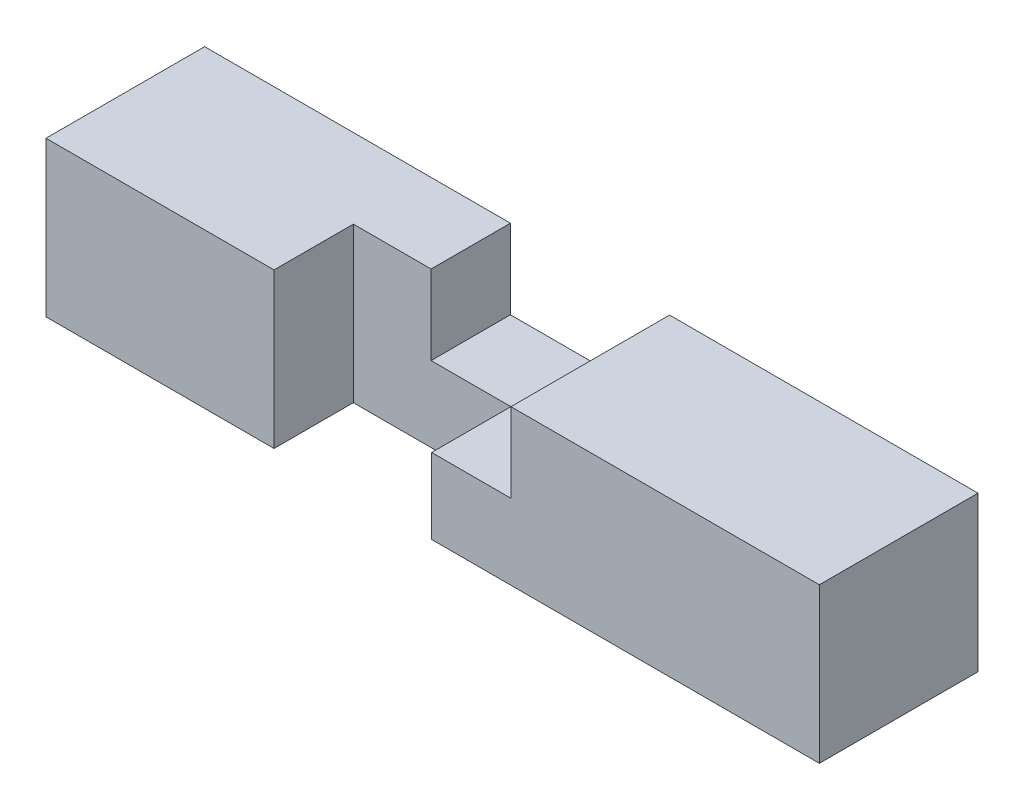
ISO-10303-21;
HEADER;
FILE_DESCRIPTION(('STEP AP214'),'2;1');
FILE_NAME('part.step','',(''),(''),'','','');
FILE_SCHEMA(('AUTOMOTIVE_DESIGN { 1 0 10303 214 1 1 1 1 }'));
ENDSEC;
DATA;
#1=APPLICATION_CONTEXT('core data for automotive mechanical design processes');
#2=APPLICATION_PROTOCOL_DEFINITION('international standard','automotive_design',2000,#1);
#3=PRODUCT_CONTEXT('',#1,'mechanical');
#4=PRODUCT('Part','Part','',(#3));
#5=PRODUCT_RELATED_PRODUCT_CATEGORY('part','',(#4));
#6=PRODUCT_DEFINITION_FORMATION('','',#4);
#7=PRODUCT_DEFINITION_CONTEXT('part definition',#1,'design');
#8=PRODUCT_DEFINITION('design','',#6,#7);
#9=PRODUCT_DEFINITION_SHAPE('','',#8);
#10=(LENGTH_UNIT() NAMED_UNIT(*) SI_UNIT(.MILLI.,.METRE.));
#11=(NAMED_UNIT(*) PLANE_ANGLE_UNIT() SI_UNIT($,.RADIAN.));
#12=(NAMED_UNIT(*) SI_UNIT($,.STERADIAN.) SOLID_ANGLE_UNIT());
#13=UNCERTAINTY_MEASURE_WITH_UNIT(LENGTH_MEASURE(1.E-05),#10,'distance_accuracy_value','');
#14=(GEOMETRIC_REPRESENTATION_CONTEXT(3) GLOBAL_UNCERTAINTY_ASSIGNED_CONTEXT((#13)) GLOBAL_UNIT_ASSIGNED_CONTEXT((#10,
#11,#12)) REPRESENTATION_CONTEXT('',''));
#15=CARTESIAN_POINT('',(0.,0.,0.));
#16=DIRECTION('',(0.,0.,1.));
#17=DIRECTION('',(1.,0.,0.));
#18=AXIS2_PLACEMENT_3D('',#15,#16,#17);
#19=CARTESIAN_POINT('',(0.,0.,20.));
#20=DIRECTION('',(0.,0.,1.));
#21=DIRECTION('',(1.,0.,0.));
#22=AXIS2_PLACEMENT_3D('',#19,#20,#21);
#23=PLANE('',#22);
#24=DIRECTION('',(0.,-1.,0.));
#25=VECTOR('',#24,1.);
#26=CARTESIAN_POINT('',(-20.,0.,20.));
#27=LINE('',#26,#25);
#28=CARTESIAN_POINT('',(-20.,9.75000000000001,20.));
#29=VERTEX_POINT('',#28);
#30=CARTESIAN_POINT('',(-20.,-9.75,20.));
#31=VERTEX_POINT('',#30);
#32=EDGE_CURVE('E480',#29,#31,#27,.T.);
#33=ORIENTED_EDGE('',*,*,#32,.F.);
#34=DIRECTION('',(-1.,0.,0.));
#35=VECTOR('',#34,1.);
#36=CARTESIAN_POINT('',(-48.7499999999999,9.75,20.));
#37=LINE('',#36,#35);
#38=CARTESIAN_POINT('',(-48.7499999999999,9.75,20.));
#39=VERTEX_POINT('',#38);
#40=EDGE_CURVE('E450',#29,#39,#37,.T.);
#41=ORIENTED_EDGE('',*,*,#40,.T.);
#42=DIRECTION('',(0.,-1.,0.));
#43=VECTOR('',#42,1.);
#44=CARTESIAN_POINT('',(-48.7499999999999,9.75,20.));
#45=LINE('',#44,#43);
#46=CARTESIAN_POINT('',(-48.7499999999999,-9.75,20.));
#47=VERTEX_POINT('',#46);
#48=EDGE_CURVE('E454',#39,#47,#45,.T.);
#49=ORIENTED_EDGE('',*,*,#48,.T.);
#50=DIRECTION('',(1.,0.,0.));
#51=VECTOR('',#50,1.);
#52=CARTESIAN_POINT('',(-48.7499999999999,-9.75,20.));
#53=LINE('',#52,#51);
#54=EDGE_CURVE('E457',#47,#31,#53,.T.);
#55=ORIENTED_EDGE('',*,*,#54,.T.);
#56=EDGE_LOOP('',(#33,#41,#49,#55));
#57=FACE_BOUND('',#56,.T.);
#58=ADVANCED_FACE('F36',(#57),#23,.T.);
#59=CARTESIAN_POINT('',(-20.,-19.25,10.));
#60=DIRECTION('',(-1.,0.,0.));
#61=DIRECTION('',(0.,0.,1.));
#62=AXIS2_PLACEMENT_3D('',#59,#60,#61);
#63=PLANE('',#62);
#64=DIRECTION('',(0.,1.,0.));
#65=VECTOR('',#64,1.);
#66=CARTESIAN_POINT('',(-20.,-19.25,10.));
#67=LINE('',#66,#65);
#68=CARTESIAN_POINT('',(-20.,-9.75,10.));
#69=VERTEX_POINT('',#68);
#70=CARTESIAN_POINT('',(-20.,9.75000000000001,10.));
#71=VERTEX_POINT('',#70);
#72=EDGE_CURVE('E441',#69,#71,#67,.T.);
#73=ORIENTED_EDGE('',*,*,#72,.T.);
#74=DIRECTION('',(0.,0.,1.));
#75=VECTOR('',#74,1.);
#76=CARTESIAN_POINT('',(-20.,9.75000000000001,10.));
#77=LINE('',#76,#75);
#78=EDGE_CURVE('E439',#71,#29,#77,.T.);
#79=ORIENTED_EDGE('',*,*,#78,.T.);
#80=ORIENTED_EDGE('',*,*,#32,.T.);
#81=DIRECTION('',(0.,0.,1.));
#82=VECTOR('',#81,1.);
#83=CARTESIAN_POINT('',(-20.,-9.74999999999999,20.));
#84=LINE('',#83,#82);
#85=EDGE_CURVE('E443',#69,#31,#84,.T.);
#86=ORIENTED_EDGE('',*,*,#85,.F.);
#87=EDGE_LOOP('',(#73,#79,#80,#86));
#88=FACE_BOUND('',#87,.T.);
#89=ADVANCED_FACE('F565',(#88),#63,.F.);
#90=CARTESIAN_POINT('',(-20.,-19.25,10.));
#91=DIRECTION('',(0.,0.,-1.));
#92=DIRECTION('',(-1.,0.,0.));
#93=AXIS2_PLACEMENT_3D('',#90,#91,#92);
#94=PLANE('',#93);
#95=DIRECTION('',(1.,0.,0.));
#96=VECTOR('',#95,1.);
#97=CARTESIAN_POINT('',(0.,-0.24999999999999,10.));
#98=LINE('',#97,#96);
#99=CARTESIAN_POINT('',(-10.2,-0.24999999999999,9.99999999999999));
#100=VERTEX_POINT('',#99);
#101=CARTESIAN_POINT('',(-0.134722900240405,-0.24999999999999,10.));
#102=VERTEX_POINT('',#101);
#103=EDGE_CURVE('E390',#100,#102,#98,.T.);
#104=ORIENTED_EDGE('',*,*,#103,.F.);
#105=DIRECTION('',(0.,-1.,0.));
#106=VECTOR('',#105,1.);
#107=CARTESIAN_POINT('',(-10.2,9.75000000000001,10.));
#108=LINE('',#107,#106);
#109=CARTESIAN_POINT('',(-10.2,9.75000000000001,10.));
#110=VERTEX_POINT('',#109);
#111=EDGE_CURVE('E280',#110,#100,#108,.T.);
#112=ORIENTED_EDGE('',*,*,#111,.F.);
#113=DIRECTION('',(1.,0.,0.));
#114=VECTOR('',#113,1.);
#115=CARTESIAN_POINT('',(-20.,9.75000000000001,10.));
#116=LINE('',#115,#114);
#117=EDGE_CURVE('E270',#71,#110,#116,.T.);
#118=ORIENTED_EDGE('',*,*,#117,.F.);
#119=ORIENTED_EDGE('',*,*,#72,.F.);
#120=DIRECTION('',(-1.,0.,0.));
#121=VECTOR('',#120,1.);
#122=CARTESIAN_POINT('',(-48.7499999999999,-9.75,10.));
#123=LINE('',#122,#121);
#124=CARTESIAN_POINT('',(-0.134722900240405,-9.75,10.));
#125=VERTEX_POINT('',#124);
#126=EDGE_CURVE('E482',#125,#69,#123,.T.);
#127=ORIENTED_EDGE('',*,*,#126,.F.);
#128=DIRECTION('',(0.,1.,0.));
#129=VECTOR('',#128,1.);
#130=CARTESIAN_POINT('',(-0.134722900240405,-10.25,10.));
#131=LINE('',#130,#129);
#132=EDGE_CURVE('E349',#125,#102,#131,.T.);
#133=ORIENTED_EDGE('',*,*,#132,.T.);
#134=EDGE_LOOP('',(#104,#112,#118,#119,#127,#133));
#135=FACE_BOUND('',#134,.T.);
#136=ADVANCED_FACE('F568',(#135),#94,.F.);
#137=CARTESIAN_POINT('',(-0.134722900240405,-10.25,10.));
#138=DIRECTION('',(-1.,0.,0.));
#139=DIRECTION('',(0.,0.,1.));
#140=AXIS2_PLACEMENT_3D('',#137,#138,#139);
#141=PLANE('',#140);
#142=DIRECTION('',(0.,0.,-1.));
#143=VECTOR('',#142,1.);
#144=CARTESIAN_POINT('',(-0.134722900240405,-9.75,10.));
#145=LINE('',#144,#143);
#146=CARTESIAN_POINT('',(-0.134722900240404,-9.75,20.));
#147=VERTEX_POINT('',#146);
#148=EDGE_CURVE('E11',#147,#125,#145,.T.);
#149=ORIENTED_EDGE('',*,*,#148,.F.);
#150=DIRECTION('',(0.,1.,0.));
#151=VECTOR('',#150,1.);
#152=CARTESIAN_POINT('',(-0.134722900240404,-10.25,20.));
#153=LINE('',#152,#151);
#154=CARTESIAN_POINT('',(-0.134722900240404,-0.24999999999999,20.));
#155=VERTEX_POINT('',#154);
#156=EDGE_CURVE('E350',#147,#155,#153,.T.);
#157=ORIENTED_EDGE('',*,*,#156,.T.);
#158=DIRECTION('',(0.,0.,1.));
#159=VECTOR('',#158,1.);
#160=CARTESIAN_POINT('',(-0.134722900240405,-0.24999999999999,10.));
#161=LINE('',#160,#159);
#162=EDGE_CURVE('E343',#102,#155,#161,.T.);
#163=ORIENTED_EDGE('',*,*,#162,.F.);
#164=ORIENTED_EDGE('',*,*,#132,.F.);
#165=EDGE_LOOP('',(#149,#157,#163,#164));
#166=FACE_BOUND('',#165,.T.);
#167=ADVANCED_FACE('F563',(#166),#141,.T.);
#168=CARTESIAN_POINT('',(0.,-0.24999999999999,0.));
#169=DIRECTION('',(0.,1.,0.));
#170=DIRECTION('',(0.,0.,1.));
#171=AXIS2_PLACEMENT_3D('',#168,#169,#170);
#172=PLANE('',#171);
#173=DIRECTION('',(-1.,0.,0.));
#174=VECTOR('',#173,1.);
#175=CARTESIAN_POINT('',(0.,-0.24999999999999,0.));
#176=LINE('',#175,#174);
#177=CARTESIAN_POINT('',(9.86527709975959,-0.24999999999999,0.));
#178=VERTEX_POINT('',#177);
#179=CARTESIAN_POINT('',(-10.2,-0.24999999999999,0.));
#180=VERTEX_POINT('',#179);
#181=EDGE_CURVE('E434',#178,#180,#176,.T.);
#182=ORIENTED_EDGE('',*,*,#181,.T.);
#183=DIRECTION('',(0.,0.,-1.));
#184=VECTOR('',#183,1.);
#185=CARTESIAN_POINT('',(-10.2,-0.24999999999999,10.));
#186=LINE('',#185,#184);
#187=EDGE_CURVE('E266',#100,#180,#186,.T.);
#188=ORIENTED_EDGE('',*,*,#187,.F.);
#189=ORIENTED_EDGE('',*,*,#103,.T.);
#190=ORIENTED_EDGE('',*,*,#162,.T.);
#191=DIRECTION('',(1.,0.,0.));
#192=VECTOR('',#191,1.);
#193=CARTESIAN_POINT('',(9.8652770997596,-0.24999999999999,20.));
#194=LINE('',#193,#192);
#195=CARTESIAN_POINT('',(9.86527709975959,-0.24999999999999,20.));
#196=VERTEX_POINT('',#195);
#197=EDGE_CURVE('E436',#155,#196,#194,.T.);
#198=ORIENTED_EDGE('',*,*,#197,.T.);
#199=DIRECTION('',(0.,0.,1.));
#200=VECTOR('',#199,1.);
#201=CARTESIAN_POINT('',(9.86527709975959,-0.24999999999999,0.));
#202=LINE('',#201,#200);
#203=EDGE_CURVE('E285',#178,#196,#202,.T.);
#204=ORIENTED_EDGE('',*,*,#203,.F.);
#205=EDGE_LOOP('',(#182,#188,#189,#190,#198,#204));
#206=FACE_BOUND('',#205,.T.);
#207=ADVANCED_FACE('F559',(#206),#172,.T.);
#208=CARTESIAN_POINT('',(-10.2,9.75000000000001,10.));
#209=DIRECTION('',(-1.,0.,0.));
#210=DIRECTION('',(0.,0.,1.));
#211=AXIS2_PLACEMENT_3D('',#208,#209,#210);
#212=PLANE('',#211);
#213=ORIENTED_EDGE('',*,*,#187,.T.);
#214=DIRECTION('',(0.,-1.,0.));
#215=VECTOR('',#214,1.);
#216=CARTESIAN_POINT('',(-10.2,9.75000000000001,0.));
#217=LINE('',#216,#215);
#218=CARTESIAN_POINT('',(-10.2,9.75000000000001,0.));
#219=VERTEX_POINT('',#218);
#220=EDGE_CURVE('E275',#219,#180,#217,.T.);
#221=ORIENTED_EDGE('',*,*,#220,.F.);
#222=DIRECTION('',(0.,0.,-1.));
#223=VECTOR('',#222,1.);
#224=CARTESIAN_POINT('',(-10.2,9.75000000000001,10.));
#225=LINE('',#224,#223);
#226=EDGE_CURVE('E272',#110,#219,#225,.T.);
#227=ORIENTED_EDGE('',*,*,#226,.F.);
#228=ORIENTED_EDGE('',*,*,#111,.T.);
#229=EDGE_LOOP('',(#213,#221,#227,#228));
#230=FACE_BOUND('',#229,.T.);
#231=ADVANCED_FACE('F562',(#230),#212,.F.);
#232=CARTESIAN_POINT('',(-48.7499999999999,9.75,20.));
#233=DIRECTION('',(0.,-1.,0.));
#234=DIRECTION('',(1.,0.,0.));
#235=AXIS2_PLACEMENT_3D('',#232,#233,#234);
#236=PLANE('',#235);
#237=ORIENTED_EDGE('',*,*,#40,.F.);
#238=ORIENTED_EDGE('',*,*,#78,.F.);
#239=ORIENTED_EDGE('',*,*,#117,.T.);
#240=ORIENTED_EDGE('',*,*,#226,.T.);
#241=DIRECTION('',(-1.,0.,0.));
#242=VECTOR('',#241,1.);
#243=CARTESIAN_POINT('',(-48.7499999999999,9.75,0.));
#244=LINE('',#243,#242);
#245=CARTESIAN_POINT('',(-48.7499999999999,9.75,0.));
#246=VERTEX_POINT('',#245);
#247=EDGE_CURVE('E463',#219,#246,#244,.T.);
#248=ORIENTED_EDGE('',*,*,#247,.T.);
#249=DIRECTION('',(0.,0.,-1.));
#250=VECTOR('',#249,1.);
#251=CARTESIAN_POINT('',(-48.7499999999999,9.75,20.));
#252=LINE('',#251,#250);
#253=EDGE_CURVE('E474',#39,#246,#252,.T.);
#254=ORIENTED_EDGE('',*,*,#253,.F.);
#255=EDGE_LOOP('',(#237,#238,#239,#240,#248,#254));
#256=FACE_BOUND('',#255,.T.);
#257=ADVANCED_FACE('F589',(#256),#236,.F.);
#258=CARTESIAN_POINT('',(-48.7499999999999,9.75,20.));
#259=DIRECTION('',(1.,0.,0.));
#260=DIRECTION('',(0.,0.,-1.));
#261=AXIS2_PLACEMENT_3D('',#258,#259,#260);
#262=PLANE('',#261);
#263=DIRECTION('',(0.,-1.,0.));
#264=VECTOR('',#263,1.);
#265=CARTESIAN_POINT('',(-48.7499999999999,9.75,0.));
#266=LINE('',#265,#264);
#267=CARTESIAN_POINT('',(-48.7499999999999,-9.75,0.));
#268=VERTEX_POINT('',#267);
#269=EDGE_CURVE('E466',#246,#268,#266,.T.);
#270=ORIENTED_EDGE('',*,*,#269,.T.);
#271=DIRECTION('',(0.,0.,-1.));
#272=VECTOR('',#271,1.);
#273=CARTESIAN_POINT('',(-48.7499999999999,-9.75,20.));
#274=LINE('',#273,#272);
#275=EDGE_CURVE('E471',#47,#268,#274,.T.);
#276=ORIENTED_EDGE('',*,*,#275,.F.);
#277=ORIENTED_EDGE('',*,*,#48,.F.);
#278=ORIENTED_EDGE('',*,*,#253,.T.);
#279=EDGE_LOOP('',(#270,#276,#277,#278));
#280=FACE_BOUND('',#279,.T.);
#281=ADVANCED_FACE('F587',(#280),#262,.F.);
#282=CARTESIAN_POINT('',(9.86527709975959,0.,0.));
#283=DIRECTION('',(1.,0.,0.));
#284=DIRECTION('',(0.,0.,-1.));
#285=AXIS2_PLACEMENT_3D('',#282,#283,#284);
#286=PLANE('',#285);
#287=DIRECTION('',(0.,-1.,0.));
#288=VECTOR('',#287,1.);
#289=CARTESIAN_POINT('',(9.86527709975959,-0.24999999999999,0.));
#290=LINE('',#289,#288);
#291=CARTESIAN_POINT('',(9.86527709975959,9.75000000000001,0.));
#292=VERTEX_POINT('',#291);
#293=EDGE_CURVE('E283',#292,#178,#290,.T.);
#294=ORIENTED_EDGE('',*,*,#293,.T.);
#295=ORIENTED_EDGE('',*,*,#203,.T.);
#296=DIRECTION('',(0.,1.,0.));
#297=VECTOR('',#296,1.);
#298=CARTESIAN_POINT('',(9.86527709975959,-0.24999999999999,20.));
#299=LINE('',#298,#297);
#300=CARTESIAN_POINT('',(9.86527709975959,9.75000000000001,20.));
#301=VERTEX_POINT('',#300);
#302=EDGE_CURVE('E287',#196,#301,#299,.T.);
#303=ORIENTED_EDGE('',*,*,#302,.T.);
#304=DIRECTION('',(0.,0.,-1.));
#305=VECTOR('',#304,1.);
#306=CARTESIAN_POINT('',(9.86527709975959,9.75000000000001,0.));
#307=LINE('',#306,#305);
#308=EDGE_CURVE('E290',#301,#292,#307,.T.);
#309=ORIENTED_EDGE('',*,*,#308,.T.);
#310=EDGE_LOOP('',(#294,#295,#303,#309));
#311=FACE_BOUND('',#310,.T.);
#312=ADVANCED_FACE('F585',(#311),#286,.F.);
#313=CARTESIAN_POINT('',(-48.7499999999999,-9.75,20.));
#314=DIRECTION('',(0.,1.,0.));
#315=DIRECTION('',(-1.,0.,0.));
#316=AXIS2_PLACEMENT_3D('',#313,#314,#315);
#317=PLANE('',#316);
#318=CARTESIAN_POINT('',(48.7499999999999,-9.74999999999998,20.));
#319=VERTEX_POINT('',#318);
#320=EDGE_CURVE('E456',#147,#319,#53,.T.);
#321=ORIENTED_EDGE('',*,*,#320,.F.);
#322=ORIENTED_EDGE('',*,*,#148,.T.);
#323=ORIENTED_EDGE('',*,*,#126,.T.);
#324=ORIENTED_EDGE('',*,*,#85,.T.);
#325=ORIENTED_EDGE('',*,*,#54,.F.);
#326=ORIENTED_EDGE('',*,*,#275,.T.);
#327=DIRECTION('',(1.,0.,0.));
#328=VECTOR('',#327,1.);
#329=CARTESIAN_POINT('',(-48.7499999999999,-9.75,0.));
#330=LINE('',#329,#328);
#331=CARTESIAN_POINT('',(48.7499999999999,-9.74999999999998,0.));
#332=VERTEX_POINT('',#331);
#333=EDGE_CURVE('E451',#268,#332,#330,.T.);
#334=ORIENTED_EDGE('',*,*,#333,.T.);
#335=DIRECTION('',(0.,0.,-1.));
#336=VECTOR('',#335,1.);
#337=CARTESIAN_POINT('',(48.7499999999999,-9.74999999999998,20.));
#338=LINE('',#337,#336);
#339=EDGE_CURVE('E460',#319,#332,#338,.T.);
#340=ORIENTED_EDGE('',*,*,#339,.F.);
#341=EDGE_LOOP('',(#321,#322,#323,#324,#325,#326,#334,#340));
#342=FACE_BOUND('',#341,.T.);
#343=ADVANCED_FACE('F582',(#342),#317,.F.);
#344=ORIENTED_EDGE('',*,*,#156,.F.);
#345=ORIENTED_EDGE('',*,*,#320,.T.);
#346=DIRECTION('',(0.,1.,0.));
#347=VECTOR('',#346,1.);
#348=CARTESIAN_POINT('',(48.7499999999999,9.75000000000002,20.));
#349=LINE('',#348,#347);
#350=CARTESIAN_POINT('',(48.7499999999999,9.75000000000002,20.));
#351=VERTEX_POINT('',#350);
#352=EDGE_CURVE('E447',#319,#351,#349,.T.);
#353=ORIENTED_EDGE('',*,*,#352,.T.);
#354=EDGE_CURVE('E452',#351,#301,#37,.T.);
#355=ORIENTED_EDGE('',*,*,#354,.T.);
#356=ORIENTED_EDGE('',*,*,#302,.F.);
#357=ORIENTED_EDGE('',*,*,#197,.F.);
#358=EDGE_LOOP('',(#344,#345,#353,#355,#356,#357));
#359=FACE_BOUND('',#358,.T.);
#360=ADVANCED_FACE('F576',(#359),#23,.T.);
#361=CARTESIAN_POINT('',(48.7499999999999,9.75000000000002,0.));
#362=VERTEX_POINT('',#361);
#363=EDGE_CURVE('E464',#362,#292,#244,.T.);
#364=ORIENTED_EDGE('',*,*,#363,.T.);
#365=ORIENTED_EDGE('',*,*,#308,.F.);
#366=ORIENTED_EDGE('',*,*,#354,.F.);
#367=DIRECTION('',(0.,0.,-1.));
#368=VECTOR('',#367,1.);
#369=CARTESIAN_POINT('',(48.7499999999999,9.75000000000002,20.));
#370=LINE('',#369,#368);
#371=EDGE_CURVE('E477',#351,#362,#370,.T.);
#372=ORIENTED_EDGE('',*,*,#371,.T.);
#373=EDGE_LOOP('',(#364,#365,#366,#372));
#374=FACE_BOUND('',#373,.T.);
#375=ADVANCED_FACE('F580',(#374),#236,.F.);
#376=CARTESIAN_POINT('',(0.,0.,0.));
#377=DIRECTION('',(0.,0.,1.));
#378=DIRECTION('',(1.,0.,0.));
#379=AXIS2_PLACEMENT_3D('',#376,#377,#378);
#380=PLANE('',#379);
#381=ORIENTED_EDGE('',*,*,#293,.F.);
#382=ORIENTED_EDGE('',*,*,#363,.F.);
#383=DIRECTION('',(0.,1.,0.));
#384=VECTOR('',#383,1.);
#385=CARTESIAN_POINT('',(48.7499999999999,9.75000000000002,0.));
#386=LINE('',#385,#384);
#387=EDGE_CURVE('E446',#332,#362,#386,.T.);
#388=ORIENTED_EDGE('',*,*,#387,.F.);
#389=ORIENTED_EDGE('',*,*,#333,.F.);
#390=ORIENTED_EDGE('',*,*,#269,.F.);
#391=ORIENTED_EDGE('',*,*,#247,.F.);
#392=ORIENTED_EDGE('',*,*,#220,.T.);
#393=ORIENTED_EDGE('',*,*,#181,.F.);
#394=EDGE_LOOP('',(#381,#382,#388,#389,#390,#391,#392,#393));
#395=FACE_BOUND('',#394,.T.);
#396=ADVANCED_FACE('F577',(#395),#380,.F.);
#397=CARTESIAN_POINT('',(48.7499999999999,9.75000000000002,20.));
#398=DIRECTION('',(-1.,0.,0.));
#399=DIRECTION('',(0.,-1.,0.));
#400=AXIS2_PLACEMENT_3D('',#397,#398,#399);
#401=PLANE('',#400);
#402=ORIENTED_EDGE('',*,*,#387,.T.);
#403=ORIENTED_EDGE('',*,*,#371,.F.);
#404=ORIENTED_EDGE('',*,*,#352,.F.);
#405=ORIENTED_EDGE('',*,*,#339,.T.);
#406=EDGE_LOOP('',(#402,#403,#404,#405));
#407=FACE_BOUND('',#406,.T.);
#408=ADVANCED_FACE('F38',(#407),#401,.F.);
#409=CLOSED_SHELL('',(#58,#89,#136,#167,#207,#231,#257,#281,#312,#343,#360,#375,#396,#408));
#410=CARTESIAN_POINT('',(-22.,-19.25,10.));
#411=DIRECTION('',(-1.,0.,0.));
#412=DIRECTION('',(0.,0.,1.));
#413=AXIS2_PLACEMENT_3D('',#410,#411,#412);
#414=PLANE('',#413);
#415=DIRECTION('',(0.,1.,0.));
#416=VECTOR('',#415,1.);
#417=CARTESIAN_POINT('',(-22.,-0.74999999999999,9.30850892046919));
#418=LINE('',#417,#416);
#419=CARTESIAN_POINT('',(-22.,-0.749999999999987,9.30850892046919));
#420=VERTEX_POINT('',#419);
#421=CARTESIAN_POINT('',(-22.,7.75000000000001,9.3085089204692));
#422=VERTEX_POINT('',#421);
#423=EDGE_CURVE('E338',#420,#422,#418,.T.);
#424=ORIENTED_EDGE('',*,*,#423,.T.);
#425=DIRECTION('',(0.,0.,1.));
#426=VECTOR('',#425,1.);
#427=CARTESIAN_POINT('',(-22.,7.75000000000001,10.));
#428=LINE('',#427,#426);
#429=CARTESIAN_POINT('',(-22.,7.75000000000001,8.));
#430=VERTEX_POINT('',#429);
#431=EDGE_CURVE('E362',#430,#422,#428,.T.);
#432=ORIENTED_EDGE('',*,*,#431,.F.);
#433=DIRECTION('',(0.,1.,0.));
#434=VECTOR('',#433,1.);
#435=CARTESIAN_POINT('',(-22.,-19.25,8.));
#436=LINE('',#435,#434);
#437=CARTESIAN_POINT('',(-22.,-7.74999999999999,8.));
#438=VERTEX_POINT('',#437);
#439=EDGE_CURVE('E377',#438,#430,#436,.T.);
#440=ORIENTED_EDGE('',*,*,#439,.F.);
#441=DIRECTION('',(0.,0.,1.));
#442=VECTOR('',#441,1.);
#443=CARTESIAN_POINT('',(-22.,-7.74999999999999,20.));
#444=LINE('',#443,#442);
#445=CARTESIAN_POINT('',(-22.,-7.74999999999999,18.));
#446=VERTEX_POINT('',#445);
#447=EDGE_CURVE('E386',#438,#446,#444,.T.);
#448=ORIENTED_EDGE('',*,*,#447,.T.);
#449=DIRECTION('',(0.,-1.,0.));
#450=VECTOR('',#449,1.);
#451=CARTESIAN_POINT('',(-22.,0.,18.));
#452=LINE('',#451,#450);
#453=CARTESIAN_POINT('',(-22.,-0.74999999999999,18.));
#454=VERTEX_POINT('',#453);
#455=EDGE_CURVE('E371',#454,#446,#452,.T.);
#456=ORIENTED_EDGE('',*,*,#455,.F.);
#457=DIRECTION('',(0.,0.,-1.));
#458=VECTOR('',#457,1.);
#459=CARTESIAN_POINT('',(-22.,-0.74999999999999,18.));
#460=LINE('',#459,#458);
#461=EDGE_CURVE('E328',#454,#420,#460,.T.);
#462=ORIENTED_EDGE('',*,*,#461,.T.);
#463=EDGE_LOOP('',(#424,#432,#440,#448,#456,#462));
#464=FACE_BOUND('',#463,.T.);
#465=ADVANCED_FACE('F515',(#464),#414,.T.);
#466=CARTESIAN_POINT('',(-48.7499999999999,7.75,20.));
#467=DIRECTION('',(0.,-1.,0.));
#468=DIRECTION('',(1.,0.,0.));
#469=AXIS2_PLACEMENT_3D('',#466,#467,#468);
#470=PLANE('',#469);
#471=DIRECTION('',(-1.,0.,0.));
#472=VECTOR('',#471,1.);
#473=CARTESIAN_POINT('',(-48.7499999999999,7.75,9.3085089204692));
#474=LINE('',#473,#472);
#475=CARTESIAN_POINT('',(-30.5,7.75,9.3085089204692));
#476=VERTEX_POINT('',#475);
#477=EDGE_CURVE('E305',#422,#476,#474,.T.);
#478=ORIENTED_EDGE('',*,*,#477,.T.);
#479=DIRECTION('',(0.,0.,1.));
#480=VECTOR('',#479,1.);
#481=CARTESIAN_POINT('',(-30.5,7.75,20.));
#482=LINE('',#481,#480);
#483=CARTESIAN_POINT('',(-30.5,7.75,10.));
#484=VERTEX_POINT('',#483);
#485=EDGE_CURVE('E302',#476,#484,#482,.T.);
#486=ORIENTED_EDGE('',*,*,#485,.T.);
#487=DIRECTION('',(1.,0.,0.));
#488=VECTOR('',#487,1.);
#489=CARTESIAN_POINT('',(-30.5019983527484,7.75,10.));
#490=LINE('',#489,#488);
#491=CARTESIAN_POINT('',(-30.5019983527484,7.75,10.));
#492=VERTEX_POINT('',#491);
#493=EDGE_CURVE('E319',#492,#484,#490,.T.);
#494=ORIENTED_EDGE('',*,*,#493,.F.);
#495=DIRECTION('',(0.,0.,1.));
#496=VECTOR('',#495,1.);
#497=CARTESIAN_POINT('',(-30.5019983527484,7.75000000000001,18.));
#498=LINE('',#497,#496);
#499=CARTESIAN_POINT('',(-30.5019983527484,7.75,18.));
#500=VERTEX_POINT('',#499);
#501=EDGE_CURVE('E316',#492,#500,#498,.T.);
#502=ORIENTED_EDGE('',*,*,#501,.T.);
#503=DIRECTION('',(-1.,0.,0.));
#504=VECTOR('',#503,1.);
#505=CARTESIAN_POINT('',(-48.7499999999999,7.75,18.));
#506=LINE('',#505,#504);
#507=CARTESIAN_POINT('',(-46.7499999999999,7.75,18.));
#508=VERTEX_POINT('',#507);
#509=EDGE_CURVE('E256',#500,#508,#506,.T.);
#510=ORIENTED_EDGE('',*,*,#509,.T.);
#511=DIRECTION('',(0.,0.,-1.));
#512=VECTOR('',#511,1.);
#513=CARTESIAN_POINT('',(-46.7499999999999,7.75,20.));
#514=LINE('',#513,#512);
#515=CARTESIAN_POINT('',(-46.7499999999999,7.75,2.));
#516=VERTEX_POINT('',#515);
#517=EDGE_CURVE('E368',#508,#516,#514,.T.);
#518=ORIENTED_EDGE('',*,*,#517,.T.);
#519=DIRECTION('',(-1.,0.,0.));
#520=VECTOR('',#519,1.);
#521=CARTESIAN_POINT('',(-48.7499999999999,7.75,2.));
#522=LINE('',#521,#520);
#523=CARTESIAN_POINT('',(-20.,7.75000000000001,2.));
#524=VERTEX_POINT('',#523);
#525=EDGE_CURVE('E364',#524,#516,#522,.T.);
#526=ORIENTED_EDGE('',*,*,#525,.F.);
#527=DIRECTION('',(0.,0.,-1.));
#528=VECTOR('',#527,1.);
#529=CARTESIAN_POINT('',(-20.,7.75000000000001,20.));
#530=LINE('',#529,#528);
#531=CARTESIAN_POINT('',(-20.,7.75000000000001,8.));
#532=VERTEX_POINT('',#531);
#533=EDGE_CURVE('E352',#532,#524,#530,.T.);
#534=ORIENTED_EDGE('',*,*,#533,.F.);
#535=DIRECTION('',(-1.,0.,0.));
#536=VECTOR('',#535,1.);
#537=CARTESIAN_POINT('',(-20.,7.75000000000001,8.));
#538=LINE('',#537,#536);
#539=EDGE_CURVE('E360',#532,#430,#538,.T.);
#540=ORIENTED_EDGE('',*,*,#539,.T.);
#541=ORIENTED_EDGE('',*,*,#431,.T.);
#542=EDGE_LOOP('',(#478,#486,#494,#502,#510,#518,#526,#534,#540,#541));
#543=FACE_BOUND('',#542,.T.);
#544=ADVANCED_FACE('F530',(#543),#470,.T.);
#545=CARTESIAN_POINT('',(-30.5019983527484,-0.24999999999999,10.));
#546=DIRECTION('',(0.,0.,-1.));
#547=DIRECTION('',(-1.,0.,0.));
#548=AXIS2_PLACEMENT_3D('',#545,#546,#547);
#549=PLANE('',#548);
#550=ORIENTED_EDGE('',*,*,#493,.T.);
#551=DIRECTION('',(0.,-1.,0.));
#552=VECTOR('',#551,1.);
#553=CARTESIAN_POINT('',(-30.5,-0.24999999999999,10.));
#554=LINE('',#553,#552);
#555=CARTESIAN_POINT('',(-30.5,-0.24999999999999,10.));
#556=VERTEX_POINT('',#555);
#557=EDGE_CURVE('E487',#484,#556,#554,.T.);
#558=ORIENTED_EDGE('',*,*,#557,.T.);
#559=DIRECTION('',(1.,0.,0.));
#560=VECTOR('',#559,1.);
#561=CARTESIAN_POINT('',(-30.5019983527484,-0.24999999999999,10.));
#562=LINE('',#561,#560);
#563=CARTESIAN_POINT('',(-30.5019983527484,-0.24999999999999,10.));
#564=VERTEX_POINT('',#563);
#565=EDGE_CURVE('E323',#564,#556,#562,.T.);
#566=ORIENTED_EDGE('',*,*,#565,.F.);
#567=DIRECTION('',(0.,1.,0.));
#568=VECTOR('',#567,1.);
#569=CARTESIAN_POINT('',(-30.5019983527484,-0.24999999999999,10.));
#570=LINE('',#569,#568);
#571=EDGE_CURVE('E313',#564,#492,#570,.T.);
#572=ORIENTED_EDGE('',*,*,#571,.T.);
#573=EDGE_LOOP('',(#550,#558,#566,#572));
#574=FACE_BOUND('',#573,.T.);
#575=ADVANCED_FACE('F543',(#574),#549,.T.);
#576=CARTESIAN_POINT('',(0.,0.,18.));
#577=DIRECTION('',(0.,0.,1.));
#578=DIRECTION('',(1.,0.,0.));
#579=AXIS2_PLACEMENT_3D('',#576,#577,#578);
#580=PLANE('',#579);
#581=DIRECTION('',(0.,-1.,0.));
#582=VECTOR('',#581,1.);
#583=CARTESIAN_POINT('',(-30.5019983527484,-0.24999999999999,18.));
#584=LINE('',#583,#582);
#585=CARTESIAN_POINT('',(-30.5019983527484,-0.24999999999999,18.));
#586=VERTEX_POINT('',#585);
#587=EDGE_CURVE('E308',#500,#586,#584,.T.);
#588=ORIENTED_EDGE('',*,*,#587,.T.);
#589=DIRECTION('',(1.,0.,0.));
#590=VECTOR('',#589,1.);
#591=CARTESIAN_POINT('',(-30.5019983527484,-0.24999999999999,18.));
#592=LINE('',#591,#590);
#593=CARTESIAN_POINT('',(-30.5,-0.24999999999999,18.));
#594=VERTEX_POINT('',#593);
#595=EDGE_CURVE('E318',#586,#594,#592,.T.);
#596=ORIENTED_EDGE('',*,*,#595,.T.);
#597=DIRECTION('',(0.,1.,0.));
#598=VECTOR('',#597,1.);
#599=CARTESIAN_POINT('',(-30.5,-0.74999999999999,18.));
#600=LINE('',#599,#598);
#601=CARTESIAN_POINT('',(-30.5,-0.74999999999999,18.));
#602=VERTEX_POINT('',#601);
#603=EDGE_CURVE('E341',#602,#594,#600,.T.);
#604=ORIENTED_EDGE('',*,*,#603,.F.);
#605=DIRECTION('',(1.,0.,0.));
#606=VECTOR('',#605,1.);
#607=CARTESIAN_POINT('',(-22.,-0.74999999999999,18.));
#608=LINE('',#607,#606);
#609=EDGE_CURVE('E336',#602,#454,#608,.T.);
#610=ORIENTED_EDGE('',*,*,#609,.T.);
#611=ORIENTED_EDGE('',*,*,#455,.T.);
#612=DIRECTION('',(1.,0.,0.));
#613=VECTOR('',#612,1.);
#614=CARTESIAN_POINT('',(-48.7499999999999,-7.75,18.));
#615=LINE('',#614,#613);
#616=CARTESIAN_POINT('',(-46.7499999999999,-7.75,18.));
#617=VERTEX_POINT('',#616);
#618=EDGE_CURVE('E380',#617,#446,#615,.T.);
#619=ORIENTED_EDGE('',*,*,#618,.F.);
#620=DIRECTION('',(0.,-1.,0.));
#621=VECTOR('',#620,1.);
#622=CARTESIAN_POINT('',(-46.7499999999999,9.75,18.));
#623=LINE('',#622,#621);
#624=EDGE_CURVE('E381',#508,#617,#623,.T.);
#625=ORIENTED_EDGE('',*,*,#624,.F.);
#626=ORIENTED_EDGE('',*,*,#509,.F.);
#627=EDGE_LOOP('',(#588,#596,#604,#610,#611,#619,#625,#626));
#628=FACE_BOUND('',#627,.T.);
#629=ADVANCED_FACE('F539',(#628),#580,.F.);
#630=CARTESIAN_POINT('',(11.8652770997596,-19.25,10.));
#631=DIRECTION('',(1.,0.,0.));
#632=DIRECTION('',(0.,0.,-1.));
#633=AXIS2_PLACEMENT_3D('',#630,#631,#632);
#634=PLANE('',#633);
#635=DIRECTION('',(0.,0.,1.));
#636=VECTOR('',#635,1.);
#637=CARTESIAN_POINT('',(11.8652770997596,-2.24999999999999,10.));
#638=LINE('',#637,#636);
#639=CARTESIAN_POINT('',(11.8652770997596,-2.24999999999999,8.));
#640=VERTEX_POINT('',#639);
#641=CARTESIAN_POINT('',(11.8652770997596,-2.24999999999999,18.));
#642=VERTEX_POINT('',#641);
#643=EDGE_CURVE('E397',#640,#642,#638,.T.);
#644=ORIENTED_EDGE('',*,*,#643,.T.);
#645=DIRECTION('',(0.,1.,0.));
#646=VECTOR('',#645,1.);
#647=CARTESIAN_POINT('',(11.8652770997596,0.,18.));
#648=LINE('',#647,#646);
#649=CARTESIAN_POINT('',(11.8652770997596,-7.74999999999999,18.));
#650=VERTEX_POINT('',#649);
#651=EDGE_CURVE('E391',#650,#642,#648,.T.);
#652=ORIENTED_EDGE('',*,*,#651,.F.);
#653=DIRECTION('',(0.,0.,-1.));
#654=VECTOR('',#653,1.);
#655=CARTESIAN_POINT('',(11.8652770997596,-7.74999999999999,20.));
#656=LINE('',#655,#654);
#657=CARTESIAN_POINT('',(11.8652770997596,-7.74999999999999,8.));
#658=VERTEX_POINT('',#657);
#659=EDGE_CURVE('E367',#650,#658,#656,.T.);
#660=ORIENTED_EDGE('',*,*,#659,.T.);
#661=DIRECTION('',(0.,1.,0.));
#662=VECTOR('',#661,1.);
#663=CARTESIAN_POINT('',(11.8652770997596,-19.25,8.));
#664=LINE('',#663,#662);
#665=EDGE_CURVE('E394',#658,#640,#664,.T.);
#666=ORIENTED_EDGE('',*,*,#665,.T.);
#667=EDGE_LOOP('',(#644,#652,#660,#666));
#668=FACE_BOUND('',#667,.T.);
#669=ADVANCED_FACE('F509',(#668),#634,.T.);
#670=DIRECTION('',(-1.,0.,0.));
#671=VECTOR('',#670,1.);
#672=CARTESIAN_POINT('',(-48.7499999999999,7.75,18.));
#673=LINE('',#672,#671);
#674=CARTESIAN_POINT('',(48.2499999999999,7.75000000000002,18.));
#675=VERTEX_POINT('',#674);
#676=CARTESIAN_POINT('',(21.8652770997596,7.75000000000001,18.));
#677=VERTEX_POINT('',#676);
#678=EDGE_CURVE('E374',#675,#677,#673,.T.);
#679=ORIENTED_EDGE('',*,*,#678,.F.);
#680=DIRECTION('',(0.,-1.,0.));
#681=VECTOR('',#680,1.);
#682=CARTESIAN_POINT('',(48.2499999999999,-7.74999999999998,18.));
#683=LINE('',#682,#681);
#684=CARTESIAN_POINT('',(48.2499999999999,-7.74999999999998,18.));
#685=VERTEX_POINT('',#684);
#686=EDGE_CURVE('E59',#675,#685,#683,.T.);
#687=ORIENTED_EDGE('',*,*,#686,.T.);
#688=DIRECTION('',(1.,0.,0.));
#689=VECTOR('',#688,1.);
#690=CARTESIAN_POINT('',(-48.7499999999999,-7.75,18.));
#691=LINE('',#690,#689);
#692=EDGE_CURVE('E261',#650,#685,#691,.T.);
#693=ORIENTED_EDGE('',*,*,#692,.F.);
#694=ORIENTED_EDGE('',*,*,#651,.T.);
#695=DIRECTION('',(1.,0.,0.));
#696=VECTOR('',#695,1.);
#697=CARTESIAN_POINT('',(0.,-2.24999999999999,18.));
#698=LINE('',#697,#696);
#699=CARTESIAN_POINT('',(21.8652770997596,-2.24999999999999,18.));
#700=VERTEX_POINT('',#699);
#701=EDGE_CURVE('E399',#642,#700,#698,.T.);
#702=ORIENTED_EDGE('',*,*,#701,.T.);
#703=DIRECTION('',(0.,1.,0.));
#704=VECTOR('',#703,1.);
#705=CARTESIAN_POINT('',(21.8652770997596,0.,18.));
#706=LINE('',#705,#704);
#707=EDGE_CURVE('E363',#700,#677,#706,.T.);
#708=ORIENTED_EDGE('',*,*,#707,.T.);
#709=EDGE_LOOP('',(#679,#687,#693,#694,#702,#708));
#710=FACE_BOUND('',#709,.T.);
#711=ADVANCED_FACE('F525',(#710),#580,.F.);
#712=DIRECTION('',(0.,0.,1.));
#713=VECTOR('',#712,1.);
#714=CARTESIAN_POINT('',(48.2499999999999,7.75000000000002,18.));
#715=LINE('',#714,#713);
#716=CARTESIAN_POINT('',(48.2499999999999,7.75000000000002,2.));
#717=VERTEX_POINT('',#716);
#718=EDGE_CURVE('E52',#717,#675,#715,.T.);
#719=ORIENTED_EDGE('',*,*,#718,.T.);
#720=ORIENTED_EDGE('',*,*,#678,.T.);
#721=DIRECTION('',(0.,0.,-1.));
#722=VECTOR('',#721,1.);
#723=CARTESIAN_POINT('',(21.8652770997596,7.75000000000001,10.));
#724=LINE('',#723,#722);
#725=CARTESIAN_POINT('',(21.8652770997596,7.75000000000001,2.));
#726=VERTEX_POINT('',#725);
#727=EDGE_CURVE('E400',#677,#726,#724,.T.);
#728=ORIENTED_EDGE('',*,*,#727,.T.);
#729=DIRECTION('',(-1.,0.,0.));
#730=VECTOR('',#729,1.);
#731=CARTESIAN_POINT('',(-48.7499999999999,7.75,2.));
#732=LINE('',#731,#730);
#733=EDGE_CURVE('E366',#717,#726,#732,.T.);
#734=ORIENTED_EDGE('',*,*,#733,.F.);
#735=EDGE_LOOP('',(#719,#720,#728,#734));
#736=FACE_BOUND('',#735,.T.);
#737=ADVANCED_FACE('F526',(#736),#470,.T.);
#738=CARTESIAN_POINT('',(-46.7499999999999,9.75,20.));
#739=DIRECTION('',(1.,0.,0.));
#740=DIRECTION('',(0.,0.,-1.));
#741=AXIS2_PLACEMENT_3D('',#738,#739,#740);
#742=PLANE('',#741);
#743=DIRECTION('',(0.,-1.,0.));
#744=VECTOR('',#743,1.);
#745=CARTESIAN_POINT('',(-46.7499999999999,9.75,2.));
#746=LINE('',#745,#744);
#747=CARTESIAN_POINT('',(-46.7499999999999,-7.75,2.));
#748=VERTEX_POINT('',#747);
#749=EDGE_CURVE('E252',#516,#748,#746,.T.);
#750=ORIENTED_EDGE('',*,*,#749,.F.);
#751=ORIENTED_EDGE('',*,*,#517,.F.);
#752=ORIENTED_EDGE('',*,*,#624,.T.);
#753=DIRECTION('',(0.,0.,-1.));
#754=VECTOR('',#753,1.);
#755=CARTESIAN_POINT('',(-46.7499999999999,-7.75,20.));
#756=LINE('',#755,#754);
#757=EDGE_CURVE('E372',#617,#748,#756,.T.);
#758=ORIENTED_EDGE('',*,*,#757,.T.);
#759=EDGE_LOOP('',(#750,#751,#752,#758));
#760=FACE_BOUND('',#759,.T.);
#761=ADVANCED_FACE('F528',(#760),#742,.T.);
#762=CARTESIAN_POINT('',(-48.7499999999999,-7.75,20.));
#763=DIRECTION('',(0.,1.,0.));
#764=DIRECTION('',(-1.,0.,0.));
#765=AXIS2_PLACEMENT_3D('',#762,#763,#764);
#766=PLANE('',#765);
#767=DIRECTION('',(0.,0.,-1.));
#768=VECTOR('',#767,1.);
#769=CARTESIAN_POINT('',(48.2499999999999,-7.74999999999998,18.));
#770=LINE('',#769,#768);
#771=CARTESIAN_POINT('',(48.2499999999999,-7.74999999999998,2.));
#772=VERTEX_POINT('',#771);
#773=EDGE_CURVE('E259',#685,#772,#770,.T.);
#774=ORIENTED_EDGE('',*,*,#773,.T.);
#775=DIRECTION('',(1.,0.,0.));
#776=VECTOR('',#775,1.);
#777=CARTESIAN_POINT('',(-48.7499999999999,-7.75,2.));
#778=LINE('',#777,#776);
#779=EDGE_CURVE('E246',#748,#772,#778,.T.);
#780=ORIENTED_EDGE('',*,*,#779,.F.);
#781=ORIENTED_EDGE('',*,*,#757,.F.);
#782=ORIENTED_EDGE('',*,*,#618,.T.);
#783=ORIENTED_EDGE('',*,*,#447,.F.);
#784=DIRECTION('',(-1.,0.,0.));
#785=VECTOR('',#784,1.);
#786=CARTESIAN_POINT('',(-48.7499999999999,-7.75,8.));
#787=LINE('',#786,#785);
#788=EDGE_CURVE('E387',#658,#438,#787,.T.);
#789=ORIENTED_EDGE('',*,*,#788,.F.);
#790=ORIENTED_EDGE('',*,*,#659,.F.);
#791=ORIENTED_EDGE('',*,*,#692,.T.);
#792=EDGE_LOOP('',(#774,#780,#781,#782,#783,#789,#790,#791));
#793=FACE_BOUND('',#792,.T.);
#794=ADVANCED_FACE('F260',(#793),#766,.T.);
#795=CARTESIAN_POINT('',(0.,0.,2.));
#796=DIRECTION('',(0.,0.,1.));
#797=DIRECTION('',(1.,0.,0.));
#798=AXIS2_PLACEMENT_3D('',#795,#796,#797);
#799=PLANE('',#798);
#800=DIRECTION('',(0.,1.,0.));
#801=VECTOR('',#800,1.);
#802=CARTESIAN_POINT('',(48.2499999999999,-7.74999999999998,2.));
#803=LINE('',#802,#801);
#804=EDGE_CURVE('E250',#772,#717,#803,.T.);
#805=ORIENTED_EDGE('',*,*,#804,.T.);
#806=ORIENTED_EDGE('',*,*,#733,.T.);
#807=DIRECTION('',(0.,1.,0.));
#808=VECTOR('',#807,1.);
#809=CARTESIAN_POINT('',(21.8652770997596,0.,2.));
#810=LINE('',#809,#808);
#811=CARTESIAN_POINT('',(21.8652770997596,-2.24999999999999,2.));
#812=VERTEX_POINT('',#811);
#813=EDGE_CURVE('E414',#812,#726,#810,.T.);
#814=ORIENTED_EDGE('',*,*,#813,.F.);
#815=DIRECTION('',(-1.,0.,0.));
#816=VECTOR('',#815,1.);
#817=CARTESIAN_POINT('',(0.,-2.24999999999999,2.));
#818=LINE('',#817,#816);
#819=CARTESIAN_POINT('',(-12.,-2.24999999999999,2.));
#820=VERTEX_POINT('',#819);
#821=EDGE_CURVE('E419',#812,#820,#818,.T.);
#822=ORIENTED_EDGE('',*,*,#821,.T.);
#823=DIRECTION('',(0.,1.,0.));
#824=VECTOR('',#823,1.);
#825=CARTESIAN_POINT('',(-12.,-0.24999999999999,2.));
#826=LINE('',#825,#824);
#827=CARTESIAN_POINT('',(-12.,-0.74999999999999,2.));
#828=VERTEX_POINT('',#827);
#829=EDGE_CURVE('E415',#820,#828,#826,.T.);
#830=ORIENTED_EDGE('',*,*,#829,.T.);
#831=DIRECTION('',(-1.,0.,0.));
#832=VECTOR('',#831,1.);
#833=CARTESIAN_POINT('',(-20.,-0.74999999999999,2.));
#834=LINE('',#833,#832);
#835=CARTESIAN_POINT('',(-20.,-0.74999999999999,2.));
#836=VERTEX_POINT('',#835);
#837=EDGE_CURVE('E296',#828,#836,#834,.T.);
#838=ORIENTED_EDGE('',*,*,#837,.T.);
#839=DIRECTION('',(0.,-1.,0.));
#840=VECTOR('',#839,1.);
#841=CARTESIAN_POINT('',(-20.,0.,2.));
#842=LINE('',#841,#840);
#843=EDGE_CURVE('E357',#524,#836,#842,.T.);
#844=ORIENTED_EDGE('',*,*,#843,.F.);
#845=ORIENTED_EDGE('',*,*,#525,.T.);
#846=ORIENTED_EDGE('',*,*,#749,.T.);
#847=ORIENTED_EDGE('',*,*,#779,.T.);
#848=EDGE_LOOP('',(#805,#806,#814,#822,#830,#838,#844,#845,#846,#847));
#849=FACE_BOUND('',#848,.T.);
#850=ADVANCED_FACE('F248',(#849),#799,.T.);
#851=CARTESIAN_POINT('',(-20.,-19.25,8.));
#852=DIRECTION('',(0.,0.,-1.));
#853=DIRECTION('',(-1.,0.,0.));
#854=AXIS2_PLACEMENT_3D('',#851,#852,#853);
#855=PLANE('',#854);
#856=DIRECTION('',(0.,1.,0.));
#857=VECTOR('',#856,1.);
#858=CARTESIAN_POINT('',(-20.,-19.25,8.));
#859=LINE('',#858,#857);
#860=CARTESIAN_POINT('',(-20.,-0.74999999999999,8.));
#861=VERTEX_POINT('',#860);
#862=EDGE_CURVE('E484',#861,#532,#859,.T.);
#863=ORIENTED_EDGE('',*,*,#862,.F.);
#864=DIRECTION('',(-1.,0.,0.));
#865=VECTOR('',#864,1.);
#866=CARTESIAN_POINT('',(-20.,-0.74999999999999,8.));
#867=LINE('',#866,#865);
#868=CARTESIAN_POINT('',(-12.,-0.74999999999999,8.));
#869=VERTEX_POINT('',#868);
#870=EDGE_CURVE('E299',#869,#861,#867,.T.);
#871=ORIENTED_EDGE('',*,*,#870,.F.);
#872=DIRECTION('',(0.,1.,0.));
#873=VECTOR('',#872,1.);
#874=CARTESIAN_POINT('',(-12.,-19.25,8.));
#875=LINE('',#874,#873);
#876=CARTESIAN_POINT('',(-12.,-2.24999999999999,8.));
#877=VERTEX_POINT('',#876);
#878=EDGE_CURVE('E418',#877,#869,#875,.T.);
#879=ORIENTED_EDGE('',*,*,#878,.F.);
#880=DIRECTION('',(1.,0.,0.));
#881=VECTOR('',#880,1.);
#882=CARTESIAN_POINT('',(-20.,-2.24999999999999,8.));
#883=LINE('',#882,#881);
#884=EDGE_CURVE('E421',#877,#640,#883,.T.);
#885=ORIENTED_EDGE('',*,*,#884,.T.);
#886=ORIENTED_EDGE('',*,*,#665,.F.);
#887=ORIENTED_EDGE('',*,*,#788,.T.);
#888=ORIENTED_EDGE('',*,*,#439,.T.);
#889=ORIENTED_EDGE('',*,*,#539,.F.);
#890=EDGE_LOOP('',(#863,#871,#879,#885,#886,#887,#888,#889));
#891=FACE_BOUND('',#890,.T.);
#892=ADVANCED_FACE('F497',(#891),#855,.T.);
#893=CARTESIAN_POINT('',(21.8652770997596,-0.24999999999999,10.));
#894=DIRECTION('',(1.,0.,0.));
#895=DIRECTION('',(0.,0.,-1.));
#896=AXIS2_PLACEMENT_3D('',#893,#894,#895);
#897=PLANE('',#896);
#898=ORIENTED_EDGE('',*,*,#727,.F.);
#899=ORIENTED_EDGE('',*,*,#707,.F.);
#900=DIRECTION('',(0.,0.,-1.));
#901=VECTOR('',#900,1.);
#902=CARTESIAN_POINT('',(21.8652770997596,-2.24999999999999,0.));
#903=LINE('',#902,#901);
#904=EDGE_CURVE('E407',#700,#812,#903,.T.);
#905=ORIENTED_EDGE('',*,*,#904,.T.);
#906=ORIENTED_EDGE('',*,*,#813,.T.);
#907=EDGE_LOOP('',(#898,#899,#905,#906));
#908=FACE_BOUND('',#907,.T.);
#909=ADVANCED_FACE('F523',(#908),#897,.T.);
#910=CARTESIAN_POINT('',(0.,-2.24999999999999,0.));
#911=DIRECTION('',(0.,1.,0.));
#912=DIRECTION('',(0.,0.,1.));
#913=AXIS2_PLACEMENT_3D('',#910,#911,#912);
#914=PLANE('',#913);
#915=ORIENTED_EDGE('',*,*,#643,.F.);
#916=ORIENTED_EDGE('',*,*,#884,.F.);
#917=DIRECTION('',(0.,0.,1.));
#918=VECTOR('',#917,1.);
#919=CARTESIAN_POINT('',(-12.,-2.24999999999999,0.));
#920=LINE('',#919,#918);
#921=EDGE_CURVE('E359',#820,#877,#920,.T.);
#922=ORIENTED_EDGE('',*,*,#921,.F.);
#923=ORIENTED_EDGE('',*,*,#821,.F.);
#924=ORIENTED_EDGE('',*,*,#904,.F.);
#925=ORIENTED_EDGE('',*,*,#701,.F.);
#926=EDGE_LOOP('',(#915,#916,#922,#923,#924,#925));
#927=FACE_BOUND('',#926,.T.);
#928=ADVANCED_FACE('F504',(#927),#914,.F.);
#929=CARTESIAN_POINT('',(-12.,-0.24999999999999,0.));
#930=DIRECTION('',(-1.,0.,0.));
#931=DIRECTION('',(0.,0.,1.));
#932=AXIS2_PLACEMENT_3D('',#929,#930,#931);
#933=PLANE('',#932);
#934=DIRECTION('',(0.,0.,1.));
#935=VECTOR('',#934,1.);
#936=CARTESIAN_POINT('',(-12.,-0.74999999999999,0.));
#937=LINE('',#936,#935);
#938=EDGE_CURVE('E45',#828,#869,#937,.T.);
#939=ORIENTED_EDGE('',*,*,#938,.F.);
#940=ORIENTED_EDGE('',*,*,#829,.F.);
#941=ORIENTED_EDGE('',*,*,#921,.T.);
#942=ORIENTED_EDGE('',*,*,#878,.T.);
#943=EDGE_LOOP('',(#939,#940,#941,#942));
#944=FACE_BOUND('',#943,.T.);
#945=ADVANCED_FACE('F499',(#944),#933,.T.);
#946=CARTESIAN_POINT('',(-30.5,-0.74999999999999,18.));
#947=DIRECTION('',(-1.,0.,0.));
#948=DIRECTION('',(0.,0.,1.));
#949=AXIS2_PLACEMENT_3D('',#946,#947,#948);
#950=PLANE('',#949);
#951=DIRECTION('',(0.,0.,1.));
#952=VECTOR('',#951,1.);
#953=CARTESIAN_POINT('',(-30.5,-0.24999999999999,18.));
#954=LINE('',#953,#952);
#955=EDGE_CURVE('E322',#556,#594,#954,.T.);
#956=ORIENTED_EDGE('',*,*,#955,.F.);
#957=ORIENTED_EDGE('',*,*,#557,.F.);
#958=ORIENTED_EDGE('',*,*,#485,.F.);
#959=DIRECTION('',(0.,1.,0.));
#960=VECTOR('',#959,1.);
#961=CARTESIAN_POINT('',(-30.5,-0.74999999999999,9.3085089204692));
#962=LINE('',#961,#960);
#963=CARTESIAN_POINT('',(-30.5,-0.74999999999999,9.3085089204692));
#964=VERTEX_POINT('',#963);
#965=EDGE_CURVE('E344',#964,#476,#962,.T.);
#966=ORIENTED_EDGE('',*,*,#965,.F.);
#967=DIRECTION('',(0.,0.,1.));
#968=VECTOR('',#967,1.);
#969=CARTESIAN_POINT('',(-30.5,-0.74999999999999,18.));
#970=LINE('',#969,#968);
#971=EDGE_CURVE('E333',#964,#602,#970,.T.);
#972=ORIENTED_EDGE('',*,*,#971,.T.);
#973=ORIENTED_EDGE('',*,*,#603,.T.);
#974=EDGE_LOOP('',(#956,#957,#958,#966,#972,#973));
#975=FACE_BOUND('',#974,.T.);
#976=ADVANCED_FACE('F558',(#975),#950,.T.);
#977=CARTESIAN_POINT('',(-22.,-0.74999999999999,9.30850892046919));
#978=DIRECTION('',(0.,0.,-1.));
#979=DIRECTION('',(-1.,0.,0.));
#980=AXIS2_PLACEMENT_3D('',#977,#978,#979);
#981=PLANE('',#980);
#982=ORIENTED_EDGE('',*,*,#965,.T.);
#983=ORIENTED_EDGE('',*,*,#477,.F.);
#984=ORIENTED_EDGE('',*,*,#423,.F.);
#985=DIRECTION('',(-1.,0.,0.));
#986=VECTOR('',#985,1.);
#987=CARTESIAN_POINT('',(-22.,-0.74999999999999,9.30850892046919));
#988=LINE('',#987,#986);
#989=EDGE_CURVE('E330',#420,#964,#988,.T.);
#990=ORIENTED_EDGE('',*,*,#989,.T.);
#991=EDGE_LOOP('',(#982,#983,#984,#990));
#992=FACE_BOUND('',#991,.T.);
#993=ADVANCED_FACE('F662',(#992),#981,.T.);
#994=CARTESIAN_POINT('',(0.,-0.74999999999999,0.));
#995=DIRECTION('',(0.,1.,0.));
#996=DIRECTION('',(0.,0.,1.));
#997=AXIS2_PLACEMENT_3D('',#994,#995,#996);
#998=PLANE('',#997);
#999=ORIENTED_EDGE('',*,*,#461,.F.);
#1000=ORIENTED_EDGE('',*,*,#609,.F.);
#1001=ORIENTED_EDGE('',*,*,#971,.F.);
#1002=ORIENTED_EDGE('',*,*,#989,.F.);
#1003=EDGE_LOOP('',(#999,#1000,#1001,#1002));
#1004=FACE_BOUND('',#1003,.T.);
#1005=ADVANCED_FACE('F658',(#1004),#998,.F.);
#1006=CARTESIAN_POINT('',(-30.5019983527484,-0.24999999999999,18.));
#1007=DIRECTION('',(0.,-1.,0.));
#1008=DIRECTION('',(0.,0.,-1.));
#1009=AXIS2_PLACEMENT_3D('',#1006,#1007,#1008);
#1010=PLANE('',#1009);
#1011=ORIENTED_EDGE('',*,*,#565,.T.);
#1012=ORIENTED_EDGE('',*,*,#955,.T.);
#1013=ORIENTED_EDGE('',*,*,#595,.F.);
#1014=DIRECTION('',(0.,0.,-1.));
#1015=VECTOR('',#1014,1.);
#1016=CARTESIAN_POINT('',(-30.5019983527484,-0.24999999999999,18.));
#1017=LINE('',#1016,#1015);
#1018=EDGE_CURVE('E310',#586,#564,#1017,.T.);
#1019=ORIENTED_EDGE('',*,*,#1018,.T.);
#1020=EDGE_LOOP('',(#1011,#1012,#1013,#1019));
#1021=FACE_BOUND('',#1020,.T.);
#1022=ADVANCED_FACE('F651',(#1021),#1010,.T.);
#1023=CARTESIAN_POINT('',(-30.5019983527484,0.,0.));
#1024=DIRECTION('',(-1.,0.,0.));
#1025=DIRECTION('',(0.,0.,1.));
#1026=AXIS2_PLACEMENT_3D('',#1023,#1024,#1025);
#1027=PLANE('',#1026);
#1028=ORIENTED_EDGE('',*,*,#587,.F.);
#1029=ORIENTED_EDGE('',*,*,#501,.F.);
#1030=ORIENTED_EDGE('',*,*,#571,.F.);
#1031=ORIENTED_EDGE('',*,*,#1018,.F.);
#1032=EDGE_LOOP('',(#1028,#1029,#1030,#1031));
#1033=FACE_BOUND('',#1032,.T.);
#1034=ADVANCED_FACE('F648',(#1033),#1027,.T.);
#1035=CARTESIAN_POINT('',(-20.,-0.74999999999999,10.));
#1036=DIRECTION('',(-1.,0.,0.));
#1037=DIRECTION('',(0.,0.,1.));
#1038=AXIS2_PLACEMENT_3D('',#1035,#1036,#1037);
#1039=PLANE('',#1038);
#1040=DIRECTION('',(0.,0.,1.));
#1041=VECTOR('',#1040,1.);
#1042=CARTESIAN_POINT('',(-20.,-0.74999999999999,10.));
#1043=LINE('',#1042,#1041);
#1044=EDGE_CURVE('E293',#836,#861,#1043,.T.);
#1045=ORIENTED_EDGE('',*,*,#1044,.T.);
#1046=ORIENTED_EDGE('',*,*,#862,.T.);
#1047=ORIENTED_EDGE('',*,*,#533,.T.);
#1048=ORIENTED_EDGE('',*,*,#843,.T.);
#1049=EDGE_LOOP('',(#1045,#1046,#1047,#1048));
#1050=FACE_BOUND('',#1049,.T.);
#1051=ADVANCED_FACE('F518',(#1050),#1039,.T.);
#1052=CARTESIAN_POINT('',(0.,-0.74999999999999,0.));
#1053=DIRECTION('',(0.,-1.,0.));
#1054=DIRECTION('',(0.,0.,-1.));
#1055=AXIS2_PLACEMENT_3D('',#1052,#1053,#1054);
#1056=PLANE('',#1055);
#1057=ORIENTED_EDGE('',*,*,#938,.T.);
#1058=ORIENTED_EDGE('',*,*,#870,.T.);
#1059=ORIENTED_EDGE('',*,*,#1044,.F.);
#1060=ORIENTED_EDGE('',*,*,#837,.F.);
#1061=EDGE_LOOP('',(#1057,#1058,#1059,#1060));
#1062=FACE_BOUND('',#1061,.T.);
#1063=ADVANCED_FACE('F491',(#1062),#1056,.T.);
#1064=CARTESIAN_POINT('',(48.2499999999999,0.,0.));
#1065=DIRECTION('',(-1.,0.,0.));
#1066=DIRECTION('',(0.,-1.,0.));
#1067=AXIS2_PLACEMENT_3D('',#1064,#1065,#1066);
#1068=PLANE('',#1067);
#1069=ORIENTED_EDGE('',*,*,#686,.F.);
#1070=ORIENTED_EDGE('',*,*,#718,.F.);
#1071=ORIENTED_EDGE('',*,*,#804,.F.);
#1072=ORIENTED_EDGE('',*,*,#773,.F.);
#1073=EDGE_LOOP('',(#1069,#1070,#1071,#1072));
#1074=FACE_BOUND('',#1073,.T.);
#1075=ADVANCED_FACE('F264',(#1074),#1068,.T.);
#1076=CLOSED_SHELL('',(#465,#544,#575,#629,#669,#711,#737,#761,#794,#850,#892,#909,#928,#945,
#976,#993,#1005,#1022,#1034,#1051,#1063,#1075));
#1077=ORIENTED_CLOSED_SHELL('',*,#1076,.T.);
#1078=BREP_WITH_VOIDS('B2',#409,(#1077));
#1079=ADVANCED_BREP_SHAPE_REPRESENTATION('',(#18,#1078),#14);
#1080=SHAPE_DEFINITION_REPRESENTATION(#9,#1079);
ENDSEC;
END-ISO-10303-21;
